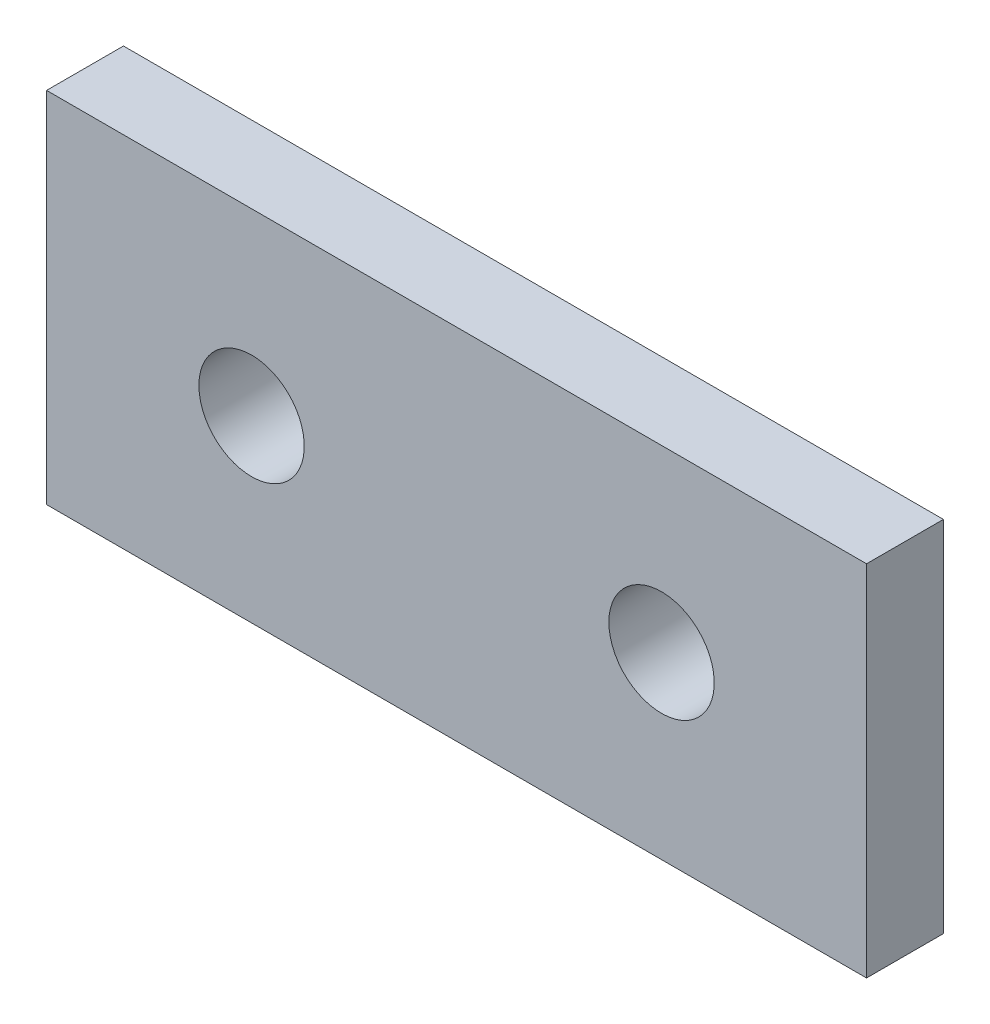
ISO-10303-21;
HEADER;
FILE_DESCRIPTION(('STEP AP214'),'2;1');
FILE_NAME('part.step','',(''),(''),'','','');
FILE_SCHEMA(('AUTOMOTIVE_DESIGN { 1 0 10303 214 1 1 1 1 }'));
ENDSEC;
DATA;
#1=APPLICATION_CONTEXT('core data for automotive mechanical design processes');
#2=APPLICATION_PROTOCOL_DEFINITION('international standard','automotive_design',2000,#1);
#3=PRODUCT_CONTEXT('',#1,'mechanical');
#4=PRODUCT('Part','Part','',(#3));
#5=PRODUCT_RELATED_PRODUCT_CATEGORY('part','',(#4));
#6=PRODUCT_DEFINITION_FORMATION('','',#4);
#7=PRODUCT_DEFINITION_CONTEXT('part definition',#1,'design');
#8=PRODUCT_DEFINITION('design','',#6,#7);
#9=PRODUCT_DEFINITION_SHAPE('','',#8);
#10=(LENGTH_UNIT() NAMED_UNIT(*) SI_UNIT(.MILLI.,.METRE.));
#11=(NAMED_UNIT(*) PLANE_ANGLE_UNIT() SI_UNIT($,.RADIAN.));
#12=(NAMED_UNIT(*) SI_UNIT($,.STERADIAN.) SOLID_ANGLE_UNIT());
#13=UNCERTAINTY_MEASURE_WITH_UNIT(LENGTH_MEASURE(1.E-05),#10,'distance_accuracy_value','');
#14=(GEOMETRIC_REPRESENTATION_CONTEXT(3) GLOBAL_UNCERTAINTY_ASSIGNED_CONTEXT((#13)) GLOBAL_UNIT_ASSIGNED_CONTEXT((#10,
#11,#12)) REPRESENTATION_CONTEXT('',''));
#15=CARTESIAN_POINT('',(0.,0.,0.));
#16=DIRECTION('',(0.,0.,1.));
#17=DIRECTION('',(1.,0.,0.));
#18=AXIS2_PLACEMENT_3D('',#15,#16,#17);
#19=CARTESIAN_POINT('',(0.,0.,2.38125));
#20=DIRECTION('',(0.,0.,-1.));
#21=DIRECTION('',(-1.,0.,0.));
#22=AXIS2_PLACEMENT_3D('',#19,#20,#21);
#23=PLANE('',#22);
#24=CARTESIAN_POINT('',(12.7,11.1125,2.38125));
#25=DIRECTION('',(0.,0.,1.));
#26=DIRECTION('',(1.,0.,0.));
#27=AXIS2_PLACEMENT_3D('',#24,#25,#26);
#28=CIRCLE('',#27,3.2639);
#29=CARTESIAN_POINT('',(9.4361,11.1125,2.38125));
#30=VERTEX_POINT('',#29);
#31=EDGE_CURVE('E103',#30,#30,#28,.T.);
#32=ORIENTED_EDGE('',*,*,#31,.F.);
#33=EDGE_LOOP('',(#32));
#34=FACE_BOUND('',#33,.T.);
#35=DIRECTION('',(1.,0.,0.));
#36=VECTOR('',#35,1.);
#37=CARTESIAN_POINT('',(50.8,0.,2.38125));
#38=LINE('',#37,#36);
#39=CARTESIAN_POINT('',(0.,0.,2.38125));
#40=VERTEX_POINT('',#39);
#41=CARTESIAN_POINT('',(50.8,0.,2.38125));
#42=VERTEX_POINT('',#41);
#43=EDGE_CURVE('E88',#40,#42,#38,.T.);
#44=ORIENTED_EDGE('',*,*,#43,.T.);
#45=DIRECTION('',(0.,1.,0.));
#46=VECTOR('',#45,1.);
#47=CARTESIAN_POINT('',(50.8,22.225,2.38125));
#48=LINE('',#47,#46);
#49=CARTESIAN_POINT('',(50.8,22.225,2.38125));
#50=VERTEX_POINT('',#49);
#51=EDGE_CURVE('E83',#42,#50,#48,.T.);
#52=ORIENTED_EDGE('',*,*,#51,.T.);
#53=DIRECTION('',(-1.,0.,0.));
#54=VECTOR('',#53,1.);
#55=CARTESIAN_POINT('',(50.8,22.225,2.38125));
#56=LINE('',#55,#54);
#57=CARTESIAN_POINT('',(0.,22.225,2.38125));
#58=VERTEX_POINT('',#57);
#59=EDGE_CURVE('E86',#50,#58,#56,.T.);
#60=ORIENTED_EDGE('',*,*,#59,.T.);
#61=DIRECTION('',(0.,-1.,0.));
#62=VECTOR('',#61,1.);
#63=CARTESIAN_POINT('',(0.,0.,2.38125));
#64=LINE('',#63,#62);
#65=EDGE_CURVE('E53',#58,#40,#64,.T.);
#66=ORIENTED_EDGE('',*,*,#65,.T.);
#67=EDGE_LOOP('',(#44,#52,#60,#66));
#68=FACE_BOUND('',#67,.T.);
#69=CARTESIAN_POINT('',(38.1,11.1125,2.38125));
#70=DIRECTION('',(0.,0.,1.));
#71=DIRECTION('',(1.,0.,0.));
#72=AXIS2_PLACEMENT_3D('',#69,#70,#71);
#73=CIRCLE('',#72,3.2639);
#74=CARTESIAN_POINT('',(34.8361,11.1125,2.38125));
#75=VERTEX_POINT('',#74);
#76=EDGE_CURVE('E118',#75,#75,#73,.T.);
#77=ORIENTED_EDGE('',*,*,#76,.F.);
#78=EDGE_LOOP('',(#77));
#79=FACE_BOUND('',#78,.T.);
#80=ADVANCED_FACE('F36',(#34,#68,#79),#23,.F.);
#81=CARTESIAN_POINT('',(0.,0.,-2.38125));
#82=DIRECTION('',(0.,0.,-1.));
#83=DIRECTION('',(-1.,0.,0.));
#84=AXIS2_PLACEMENT_3D('',#81,#82,#83);
#85=PLANE('',#84);
#86=CARTESIAN_POINT('',(12.7,11.1125,-2.38125));
#87=DIRECTION('',(0.,0.,1.));
#88=DIRECTION('',(1.,0.,0.));
#89=AXIS2_PLACEMENT_3D('',#86,#87,#88);
#90=CIRCLE('',#89,3.2639);
#91=CARTESIAN_POINT('',(9.4361,11.1125,-2.38125));
#92=VERTEX_POINT('',#91);
#93=EDGE_CURVE('E115',#92,#92,#90,.T.);
#94=ORIENTED_EDGE('',*,*,#93,.T.);
#95=EDGE_LOOP('',(#94));
#96=FACE_BOUND('',#95,.T.);
#97=DIRECTION('',(1.,0.,0.));
#98=VECTOR('',#97,1.);
#99=CARTESIAN_POINT('',(50.8,0.,-2.38125));
#100=LINE('',#99,#98);
#101=CARTESIAN_POINT('',(0.,0.,-2.38125));
#102=VERTEX_POINT('',#101);
#103=CARTESIAN_POINT('',(50.8,0.,-2.38125));
#104=VERTEX_POINT('',#103);
#105=EDGE_CURVE('E100',#102,#104,#100,.T.);
#106=ORIENTED_EDGE('',*,*,#105,.F.);
#107=DIRECTION('',(0.,-1.,0.));
#108=VECTOR('',#107,1.);
#109=CARTESIAN_POINT('',(0.,0.,-2.38125));
#110=LINE('',#109,#108);
#111=CARTESIAN_POINT('',(0.,22.225,-2.38125));
#112=VERTEX_POINT('',#111);
#113=EDGE_CURVE('E76',#112,#102,#110,.T.);
#114=ORIENTED_EDGE('',*,*,#113,.F.);
#115=DIRECTION('',(-1.,0.,0.));
#116=VECTOR('',#115,1.);
#117=CARTESIAN_POINT('',(50.8,22.225,-2.38125));
#118=LINE('',#117,#116);
#119=CARTESIAN_POINT('',(50.8,22.225,-2.38125));
#120=VERTEX_POINT('',#119);
#121=EDGE_CURVE('E70',#120,#112,#118,.T.);
#122=ORIENTED_EDGE('',*,*,#121,.F.);
#123=DIRECTION('',(0.,1.,0.));
#124=VECTOR('',#123,1.);
#125=CARTESIAN_POINT('',(50.8,22.225,-2.38125));
#126=LINE('',#125,#124);
#127=EDGE_CURVE('E92',#104,#120,#126,.T.);
#128=ORIENTED_EDGE('',*,*,#127,.F.);
#129=EDGE_LOOP('',(#106,#114,#122,#128));
#130=FACE_BOUND('',#129,.T.);
#131=CARTESIAN_POINT('',(38.1,11.1125,-2.38125));
#132=DIRECTION('',(0.,0.,1.));
#133=DIRECTION('',(1.,0.,0.));
#134=AXIS2_PLACEMENT_3D('',#131,#132,#133);
#135=CIRCLE('',#134,3.2639);
#136=CARTESIAN_POINT('',(34.8361,11.1125,-2.38125));
#137=VERTEX_POINT('',#136);
#138=EDGE_CURVE('E121',#137,#137,#135,.T.);
#139=ORIENTED_EDGE('',*,*,#138,.T.);
#140=EDGE_LOOP('',(#139));
#141=FACE_BOUND('',#140,.T.);
#142=ADVANCED_FACE('F111',(#96,#130,#141),#85,.T.);
#143=CARTESIAN_POINT('',(50.8,0.,2.38125));
#144=DIRECTION('',(0.,1.,0.));
#145=DIRECTION('',(-1.,0.,0.));
#146=AXIS2_PLACEMENT_3D('',#143,#144,#145);
#147=PLANE('',#146);
#148=ORIENTED_EDGE('',*,*,#105,.T.);
#149=DIRECTION('',(0.,0.,-1.));
#150=VECTOR('',#149,1.);
#151=CARTESIAN_POINT('',(50.8,0.,2.38125));
#152=LINE('',#151,#150);
#153=EDGE_CURVE('E11',#42,#104,#152,.T.);
#154=ORIENTED_EDGE('',*,*,#153,.F.);
#155=ORIENTED_EDGE('',*,*,#43,.F.);
#156=DIRECTION('',(0.,0.,-1.));
#157=VECTOR('',#156,1.);
#158=CARTESIAN_POINT('',(0.,0.,2.38125));
#159=LINE('',#158,#157);
#160=EDGE_CURVE('E96',#40,#102,#159,.T.);
#161=ORIENTED_EDGE('',*,*,#160,.T.);
#162=EDGE_LOOP('',(#148,#154,#155,#161));
#163=FACE_BOUND('',#162,.T.);
#164=ADVANCED_FACE('F38',(#163),#147,.F.);
#165=CARTESIAN_POINT('',(50.8,22.225,2.38125));
#166=DIRECTION('',(-1.,0.,0.));
#167=DIRECTION('',(0.,0.,1.));
#168=AXIS2_PLACEMENT_3D('',#165,#166,#167);
#169=PLANE('',#168);
#170=ORIENTED_EDGE('',*,*,#127,.T.);
#171=DIRECTION('',(0.,0.,-1.));
#172=VECTOR('',#171,1.);
#173=CARTESIAN_POINT('',(50.8,22.225,2.38125));
#174=LINE('',#173,#172);
#175=EDGE_CURVE('E45',#50,#120,#174,.T.);
#176=ORIENTED_EDGE('',*,*,#175,.F.);
#177=ORIENTED_EDGE('',*,*,#51,.F.);
#178=ORIENTED_EDGE('',*,*,#153,.T.);
#179=EDGE_LOOP('',(#170,#176,#177,#178));
#180=FACE_BOUND('',#179,.T.);
#181=ADVANCED_FACE('F91',(#180),#169,.F.);
#182=CARTESIAN_POINT('',(50.8,22.225,2.38125));
#183=DIRECTION('',(0.,-1.,0.));
#184=DIRECTION('',(0.,0.,-1.));
#185=AXIS2_PLACEMENT_3D('',#182,#183,#184);
#186=PLANE('',#185);
#187=ORIENTED_EDGE('',*,*,#121,.T.);
#188=DIRECTION('',(0.,0.,-1.));
#189=VECTOR('',#188,1.);
#190=CARTESIAN_POINT('',(0.,22.225,2.38125));
#191=LINE('',#190,#189);
#192=EDGE_CURVE('E93',#58,#112,#191,.T.);
#193=ORIENTED_EDGE('',*,*,#192,.F.);
#194=ORIENTED_EDGE('',*,*,#59,.F.);
#195=ORIENTED_EDGE('',*,*,#175,.T.);
#196=EDGE_LOOP('',(#187,#193,#194,#195));
#197=FACE_BOUND('',#196,.T.);
#198=ADVANCED_FACE('F94',(#197),#186,.F.);
#199=CARTESIAN_POINT('',(0.,0.,2.38125));
#200=DIRECTION('',(1.,0.,0.));
#201=DIRECTION('',(0.,0.,-1.));
#202=AXIS2_PLACEMENT_3D('',#199,#200,#201);
#203=PLANE('',#202);
#204=ORIENTED_EDGE('',*,*,#113,.T.);
#205=ORIENTED_EDGE('',*,*,#160,.F.);
#206=ORIENTED_EDGE('',*,*,#65,.F.);
#207=ORIENTED_EDGE('',*,*,#192,.T.);
#208=EDGE_LOOP('',(#204,#205,#206,#207));
#209=FACE_BOUND('',#208,.T.);
#210=ADVANCED_FACE('F108',(#209),#203,.F.);
#211=CARTESIAN_POINT('',(12.7,11.1125,2.38125));
#212=DIRECTION('',(0.,0.,-1.));
#213=DIRECTION('',(-1.,0.,0.));
#214=AXIS2_PLACEMENT_3D('',#211,#212,#213);
#215=CYLINDRICAL_SURFACE('',#214,3.2639);
#216=CARTESIAN_POINT('',(9.4361,11.1125,2.38125));
#217=CARTESIAN_POINT('',(9.4361,11.1125,2.331640625));
#218=CARTESIAN_POINT('',(9.4361,11.1125,2.28203125));
#219=CARTESIAN_POINT('',(9.4361,11.1125,2.1828125));
#220=CARTESIAN_POINT('',(9.4361,11.1125,2.133203125));
#221=CARTESIAN_POINT('',(9.4361,11.1125,2.033984375));
#222=CARTESIAN_POINT('',(9.4361,11.1125,1.984375));
#223=CARTESIAN_POINT('',(9.4361,11.1125,1.88515625));
#224=CARTESIAN_POINT('',(9.4361,11.1125,1.835546875));
#225=CARTESIAN_POINT('',(9.4361,11.1125,1.736328125));
#226=CARTESIAN_POINT('',(9.4361,11.1125,1.68671875));
#227=CARTESIAN_POINT('',(9.4361,11.1125,1.5875));
#228=CARTESIAN_POINT('',(9.4361,11.1125,1.537890625));
#229=CARTESIAN_POINT('',(9.4361,11.1125,1.438671875));
#230=CARTESIAN_POINT('',(9.4361,11.1125,1.3890625));
#231=CARTESIAN_POINT('',(9.4361,11.1125,1.28984375));
#232=CARTESIAN_POINT('',(9.4361,11.1125,1.240234375));
#233=CARTESIAN_POINT('',(9.4361,11.1125,1.141015625));
#234=CARTESIAN_POINT('',(9.4361,11.1125,1.09140625));
#235=CARTESIAN_POINT('',(9.4361,11.1125,0.9921875));
#236=CARTESIAN_POINT('',(9.4361,11.1125,0.942578125));
#237=CARTESIAN_POINT('',(9.4361,11.1125,0.843359375));
#238=CARTESIAN_POINT('',(9.4361,11.1125,0.79375));
#239=CARTESIAN_POINT('',(9.4361,11.1125,0.69453125));
#240=CARTESIAN_POINT('',(9.4361,11.1125,0.644921875));
#241=CARTESIAN_POINT('',(9.4361,11.1125,0.545703125));
#242=CARTESIAN_POINT('',(9.4361,11.1125,0.49609375));
#243=CARTESIAN_POINT('',(9.4361,11.1125,0.396875));
#244=CARTESIAN_POINT('',(9.4361,11.1125,0.347265625));
#245=CARTESIAN_POINT('',(9.4361,11.1125,0.248046875));
#246=CARTESIAN_POINT('',(9.4361,11.1125,0.1984375));
#247=CARTESIAN_POINT('',(9.4361,11.1125,0.0992187499999996));
#248=CARTESIAN_POINT('',(9.4361,11.1125,0.0496093749999996));
#249=CARTESIAN_POINT('',(9.4361,11.1125,-0.0496093750000005));
#250=CARTESIAN_POINT('',(9.4361,11.1125,-0.0992187500000005));
#251=CARTESIAN_POINT('',(9.4361,11.1125,-0.198437500000001));
#252=CARTESIAN_POINT('',(9.4361,11.1125,-0.248046875000001));
#253=CARTESIAN_POINT('',(9.4361,11.1125,-0.347265625000001));
#254=CARTESIAN_POINT('',(9.4361,11.1125,-0.396875000000001));
#255=CARTESIAN_POINT('',(9.4361,11.1125,-0.496093750000001));
#256=CARTESIAN_POINT('',(9.4361,11.1125,-0.545703125000001));
#257=CARTESIAN_POINT('',(9.4361,11.1125,-0.644921875000001));
#258=CARTESIAN_POINT('',(9.4361,11.1125,-0.694531250000001));
#259=CARTESIAN_POINT('',(9.4361,11.1125,-0.793750000000001));
#260=CARTESIAN_POINT('',(9.4361,11.1125,-0.843359375));
#261=CARTESIAN_POINT('',(9.4361,11.1125,-0.942578125000001));
#262=CARTESIAN_POINT('',(9.4361,11.1125,-0.992187500000001));
#263=CARTESIAN_POINT('',(9.4361,11.1125,-1.09140625));
#264=CARTESIAN_POINT('',(9.4361,11.1125,-1.141015625));
#265=CARTESIAN_POINT('',(9.4361,11.1125,-1.240234375));
#266=CARTESIAN_POINT('',(9.4361,11.1125,-1.28984375));
#267=CARTESIAN_POINT('',(9.4361,11.1125,-1.3890625));
#268=CARTESIAN_POINT('',(9.4361,11.1125,-1.438671875));
#269=CARTESIAN_POINT('',(9.4361,11.1125,-1.537890625));
#270=CARTESIAN_POINT('',(9.4361,11.1125,-1.5875));
#271=CARTESIAN_POINT('',(9.4361,11.1125,-1.68671875));
#272=CARTESIAN_POINT('',(9.4361,11.1125,-1.736328125));
#273=CARTESIAN_POINT('',(9.4361,11.1125,-1.835546875));
#274=CARTESIAN_POINT('',(9.4361,11.1125,-1.88515625));
#275=CARTESIAN_POINT('',(9.4361,11.1125,-1.984375));
#276=CARTESIAN_POINT('',(9.4361,11.1125,-2.033984375));
#277=CARTESIAN_POINT('',(9.4361,11.1125,-2.133203125));
#278=CARTESIAN_POINT('',(9.4361,11.1125,-2.1828125));
#279=CARTESIAN_POINT('',(9.4361,11.1125,-2.28203125));
#280=CARTESIAN_POINT('',(9.4361,11.1125,-2.331640625));
#281=CARTESIAN_POINT('',(9.4361,11.1125,-2.38125));
#282=B_SPLINE_CURVE_WITH_KNOTS('',3,(#216,#217,#218,#219,#220,#221,#222,#223,#224,#225,#226,
#227,#228,#229,#230,#231,#232,#233,#234,#235,#236,#237,#238,#239,#240,#241,#242,#243,#244,#245,
#246,#247,#248,#249,#250,#251,#252,#253,#254,#255,#256,#257,#258,#259,#260,#261,#262,#263,#264,
#265,#266,#267,#268,#269,#270,#271,#272,#273,#274,#275,#276,#277,#278,#279,#280,#281),
.UNSPECIFIED.,.F.,.F.,(4,2,2,2,2,2,2,2,2,2,2,2,2,2,2,2,2,2,2,2,2,2,2,2,2,2,2,2,2,2,2,2,4),(0.,
0.148828125,0.29765625,0.446484375,0.5953125,0.744140625,0.89296875,1.041796875,1.190625,
1.339453125,1.48828125,1.637109375,1.7859375,1.934765625,2.08359375,2.232421875,2.38125,
2.530078125,2.67890625,2.827734375,2.9765625,3.125390625,3.27421875,3.423046875,3.571875,
3.720703125,3.86953125,4.018359375,4.1671875,4.316015625,4.46484375,4.613671875,4.7625),.UNSPECIFIED.);
#283=EDGE_CURVE('BSEAM139',#30,#92,#282,.T.);
#284=ORIENTED_EDGE('',*,*,#31,.T.);
#285=ORIENTED_EDGE('',*,*,#93,.F.);
#286=ORIENTED_EDGE('',*,*,#283,.T.);
#287=ORIENTED_EDGE('',*,*,#283,.F.);
#288=EDGE_LOOP('',(#284,#286,#285,#287));
#289=FACE_BOUND('',#288,.T.);
#290=ADVANCED_FACE('F139',(#289),#215,.F.);
#291=CARTESIAN_POINT('',(38.1,11.1125,2.38125));
#292=DIRECTION('',(0.,0.,-1.));
#293=DIRECTION('',(-1.,0.,0.));
#294=AXIS2_PLACEMENT_3D('',#291,#292,#293);
#295=CYLINDRICAL_SURFACE('',#294,3.2639);
#296=CARTESIAN_POINT('',(34.8361,11.1125,2.38125));
#297=CARTESIAN_POINT('',(34.8361,11.1125,2.331640625));
#298=CARTESIAN_POINT('',(34.8361,11.1125,2.28203125));
#299=CARTESIAN_POINT('',(34.8361,11.1125,2.1828125));
#300=CARTESIAN_POINT('',(34.8361,11.1125,2.133203125));
#301=CARTESIAN_POINT('',(34.8361,11.1125,2.033984375));
#302=CARTESIAN_POINT('',(34.8361,11.1125,1.984375));
#303=CARTESIAN_POINT('',(34.8361,11.1125,1.88515625));
#304=CARTESIAN_POINT('',(34.8361,11.1125,1.835546875));
#305=CARTESIAN_POINT('',(34.8361,11.1125,1.736328125));
#306=CARTESIAN_POINT('',(34.8361,11.1125,1.68671875));
#307=CARTESIAN_POINT('',(34.8361,11.1125,1.5875));
#308=CARTESIAN_POINT('',(34.8361,11.1125,1.537890625));
#309=CARTESIAN_POINT('',(34.8361,11.1125,1.438671875));
#310=CARTESIAN_POINT('',(34.8361,11.1125,1.3890625));
#311=CARTESIAN_POINT('',(34.8361,11.1125,1.28984375));
#312=CARTESIAN_POINT('',(34.8361,11.1125,1.240234375));
#313=CARTESIAN_POINT('',(34.8361,11.1125,1.141015625));
#314=CARTESIAN_POINT('',(34.8361,11.1125,1.09140625));
#315=CARTESIAN_POINT('',(34.8361,11.1125,0.9921875));
#316=CARTESIAN_POINT('',(34.8361,11.1125,0.942578125));
#317=CARTESIAN_POINT('',(34.8361,11.1125,0.843359375));
#318=CARTESIAN_POINT('',(34.8361,11.1125,0.79375));
#319=CARTESIAN_POINT('',(34.8361,11.1125,0.69453125));
#320=CARTESIAN_POINT('',(34.8361,11.1125,0.644921875));
#321=CARTESIAN_POINT('',(34.8361,11.1125,0.545703125));
#322=CARTESIAN_POINT('',(34.8361,11.1125,0.49609375));
#323=CARTESIAN_POINT('',(34.8361,11.1125,0.396875));
#324=CARTESIAN_POINT('',(34.8361,11.1125,0.347265625));
#325=CARTESIAN_POINT('',(34.8361,11.1125,0.248046875));
#326=CARTESIAN_POINT('',(34.8361,11.1125,0.1984375));
#327=CARTESIAN_POINT('',(34.8361,11.1125,0.0992187499999996));
#328=CARTESIAN_POINT('',(34.8361,11.1125,0.0496093749999996));
#329=CARTESIAN_POINT('',(34.8361,11.1125,-0.0496093750000005));
#330=CARTESIAN_POINT('',(34.8361,11.1125,-0.0992187500000005));
#331=CARTESIAN_POINT('',(34.8361,11.1125,-0.198437500000001));
#332=CARTESIAN_POINT('',(34.8361,11.1125,-0.248046875000001));
#333=CARTESIAN_POINT('',(34.8361,11.1125,-0.347265625000001));
#334=CARTESIAN_POINT('',(34.8361,11.1125,-0.396875000000001));
#335=CARTESIAN_POINT('',(34.8361,11.1125,-0.496093750000001));
#336=CARTESIAN_POINT('',(34.8361,11.1125,-0.545703125000001));
#337=CARTESIAN_POINT('',(34.8361,11.1125,-0.644921875000001));
#338=CARTESIAN_POINT('',(34.8361,11.1125,-0.694531250000001));
#339=CARTESIAN_POINT('',(34.8361,11.1125,-0.793750000000001));
#340=CARTESIAN_POINT('',(34.8361,11.1125,-0.843359375));
#341=CARTESIAN_POINT('',(34.8361,11.1125,-0.942578125000001));
#342=CARTESIAN_POINT('',(34.8361,11.1125,-0.992187500000001));
#343=CARTESIAN_POINT('',(34.8361,11.1125,-1.09140625));
#344=CARTESIAN_POINT('',(34.8361,11.1125,-1.141015625));
#345=CARTESIAN_POINT('',(34.8361,11.1125,-1.240234375));
#346=CARTESIAN_POINT('',(34.8361,11.1125,-1.28984375));
#347=CARTESIAN_POINT('',(34.8361,11.1125,-1.3890625));
#348=CARTESIAN_POINT('',(34.8361,11.1125,-1.438671875));
#349=CARTESIAN_POINT('',(34.8361,11.1125,-1.537890625));
#350=CARTESIAN_POINT('',(34.8361,11.1125,-1.5875));
#351=CARTESIAN_POINT('',(34.8361,11.1125,-1.68671875));
#352=CARTESIAN_POINT('',(34.8361,11.1125,-1.736328125));
#353=CARTESIAN_POINT('',(34.8361,11.1125,-1.835546875));
#354=CARTESIAN_POINT('',(34.8361,11.1125,-1.88515625));
#355=CARTESIAN_POINT('',(34.8361,11.1125,-1.984375));
#356=CARTESIAN_POINT('',(34.8361,11.1125,-2.033984375));
#357=CARTESIAN_POINT('',(34.8361,11.1125,-2.133203125));
#358=CARTESIAN_POINT('',(34.8361,11.1125,-2.1828125));
#359=CARTESIAN_POINT('',(34.8361,11.1125,-2.28203125));
#360=CARTESIAN_POINT('',(34.8361,11.1125,-2.331640625));
#361=CARTESIAN_POINT('',(34.8361,11.1125,-2.38125));
#362=B_SPLINE_CURVE_WITH_KNOTS('',3,(#296,#297,#298,#299,#300,#301,#302,#303,#304,#305,#306,
#307,#308,#309,#310,#311,#312,#313,#314,#315,#316,#317,#318,#319,#320,#321,#322,#323,#324,#325,
#326,#327,#328,#329,#330,#331,#332,#333,#334,#335,#336,#337,#338,#339,#340,#341,#342,#343,#344,
#345,#346,#347,#348,#349,#350,#351,#352,#353,#354,#355,#356,#357,#358,#359,#360,#361),
.UNSPECIFIED.,.F.,.F.,(4,2,2,2,2,2,2,2,2,2,2,2,2,2,2,2,2,2,2,2,2,2,2,2,2,2,2,2,2,2,2,2,4),(0.,
0.148828125,0.29765625,0.446484375,0.5953125,0.744140625,0.89296875,1.041796875,1.190625,
1.339453125,1.48828125,1.637109375,1.7859375,1.934765625,2.08359375,2.232421875,2.38125,
2.530078125,2.67890625,2.827734375,2.9765625,3.125390625,3.27421875,3.423046875,3.571875,
3.720703125,3.86953125,4.018359375,4.1671875,4.316015625,4.46484375,4.613671875,4.7625),.UNSPECIFIED.);
#363=EDGE_CURVE('BSEAM127',#75,#137,#362,.T.);
#364=ORIENTED_EDGE('',*,*,#76,.T.);
#365=ORIENTED_EDGE('',*,*,#138,.F.);
#366=ORIENTED_EDGE('',*,*,#363,.T.);
#367=ORIENTED_EDGE('',*,*,#363,.F.);
#368=EDGE_LOOP('',(#364,#366,#365,#367));
#369=FACE_BOUND('',#368,.T.);
#370=ADVANCED_FACE('F127',(#369),#295,.F.);
#371=CLOSED_SHELL('',(#80,#142,#164,#181,#198,#210,#290,#370));
#372=MANIFOLD_SOLID_BREP('B2',#371);
#373=ADVANCED_BREP_SHAPE_REPRESENTATION('',(#18,#372),#14);
#374=SHAPE_DEFINITION_REPRESENTATION(#9,#373);
ENDSEC;
END-ISO-10303-21;
